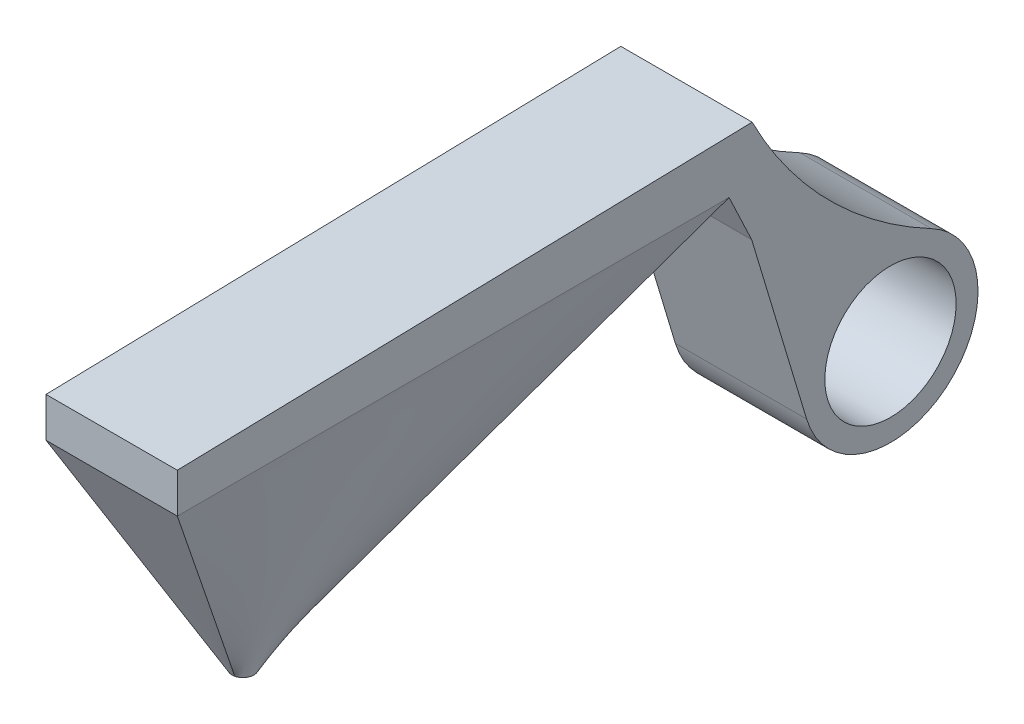
ISO-10303-21;
HEADER;
FILE_DESCRIPTION(('STEP AP214'),'2;1');
FILE_NAME('part.step','',(''),(''),'','','');
FILE_SCHEMA(('AUTOMOTIVE_DESIGN { 1 0 10303 214 1 1 1 1 }'));
ENDSEC;
DATA;
#1=APPLICATION_CONTEXT('core data for automotive mechanical design processes');
#2=APPLICATION_PROTOCOL_DEFINITION('international standard','automotive_design',2000,#1);
#3=PRODUCT_CONTEXT('',#1,'mechanical');
#4=PRODUCT('Part','Part','',(#3));
#5=PRODUCT_RELATED_PRODUCT_CATEGORY('part','',(#4));
#6=PRODUCT_DEFINITION_FORMATION('','',#4);
#7=PRODUCT_DEFINITION_CONTEXT('part definition',#1,'design');
#8=PRODUCT_DEFINITION('design','',#6,#7);
#9=PRODUCT_DEFINITION_SHAPE('','',#8);
#10=(LENGTH_UNIT() NAMED_UNIT(*) SI_UNIT(.MILLI.,.METRE.));
#11=(NAMED_UNIT(*) PLANE_ANGLE_UNIT() SI_UNIT($,.RADIAN.));
#12=(NAMED_UNIT(*) SI_UNIT($,.STERADIAN.) SOLID_ANGLE_UNIT());
#13=UNCERTAINTY_MEASURE_WITH_UNIT(LENGTH_MEASURE(1.E-05),#10,'distance_accuracy_value','');
#14=(GEOMETRIC_REPRESENTATION_CONTEXT(3) GLOBAL_UNCERTAINTY_ASSIGNED_CONTEXT((#13)) GLOBAL_UNIT_ASSIGNED_CONTEXT((#10,
#11,#12)) REPRESENTATION_CONTEXT('',''));
#15=CARTESIAN_POINT('',(0.,0.,0.));
#16=DIRECTION('',(0.,0.,1.));
#17=DIRECTION('',(1.,0.,0.));
#18=AXIS2_PLACEMENT_3D('',#15,#16,#17);
#19=CARTESIAN_POINT('',(3.,-0.907670555941161,0.));
#20=DIRECTION('',(0.,1.,0.));
#21=DIRECTION('',(0.,0.,1.));
#22=AXIS2_PLACEMENT_3D('',#19,#20,#21);
#23=PLANE('',#22);
#24=CARTESIAN_POINT('',(0.,-0.907670555941161,0.));
#25=CARTESIAN_POINT('',(0.,-0.907670555941161,-1.05048056428268));
#26=CARTESIAN_POINT('',(0.,-0.907670555941161,-2.10096112856537));
#27=CARTESIAN_POINT('',(0.,-0.907670555941161,-4.20192225713073));
#28=CARTESIAN_POINT('',(0.,-0.907670555941161,-5.25240282141341));
#29=CARTESIAN_POINT('',(0.,-0.907670555941161,-7.35336394997876));
#30=CARTESIAN_POINT('',(0.,-0.907670555941161,-8.40384451426144));
#31=CARTESIAN_POINT('',(0.,-0.907670555941161,-10.5048056428268));
#32=CARTESIAN_POINT('',(0.,-0.907670555941161,-11.5552862071095));
#33=CARTESIAN_POINT('',(0.,-0.907670555941161,-12.6057667713921));
#34=B_SPLINE_CURVE_WITH_KNOTS('',3,(#24,#25,#26,#27,#28,#29,#30,#31,#32,#33),.UNSPECIFIED.,.F.,
.F.,(4,2,2,2,4),(0.,0.25,0.5,0.75,1.),.UNSPECIFIED.);
#35=CARTESIAN_POINT('',(0.,-0.907670555941161,0.));
#36=VERTEX_POINT('',#35);
#37=CARTESIAN_POINT('',(0.,-0.907670555941161,-12.6057667713921));
#38=VERTEX_POINT('',#37);
#39=EDGE_CURVE('E227',#36,#38,#34,.T.);
#40=ORIENTED_EDGE('',*,*,#39,.F.);
#41=CARTESIAN_POINT('',(3.,-0.907670555941161,0.));
#42=CARTESIAN_POINT('',(2.5,-0.907670555941161,0.));
#43=CARTESIAN_POINT('',(2.,-0.907670555941161,0.));
#44=CARTESIAN_POINT('',(0.999999999999998,-0.907670555941161,0.));
#45=CARTESIAN_POINT('',(0.499999999999999,-0.907670555941161,0.));
#46=CARTESIAN_POINT('',(0.,-0.907670555941161,0.));
#47=B_SPLINE_CURVE_WITH_KNOTS('',3,(#41,#42,#43,#44,#45,#46),.UNSPECIFIED.,.F.,.F.,(4,2,4),(0.,
0.5,1.),.UNSPECIFIED.);
#48=CARTESIAN_POINT('',(3.,-0.907670555941161,0.));
#49=VERTEX_POINT('',#48);
#50=EDGE_CURVE('E12',#49,#36,#47,.T.);
#51=ORIENTED_EDGE('',*,*,#50,.F.);
#52=CARTESIAN_POINT('',(3.,-0.907670555941161,-12.6057667713921));
#53=CARTESIAN_POINT('',(3.,-0.907670555941161,-11.5552862071095));
#54=CARTESIAN_POINT('',(3.,-0.907670555941161,-10.5048056428268));
#55=CARTESIAN_POINT('',(3.,-0.907670555941161,-8.40384451426143));
#56=CARTESIAN_POINT('',(3.,-0.907670555941161,-7.35336394997875));
#57=CARTESIAN_POINT('',(3.,-0.907670555941161,-5.2524028214134));
#58=CARTESIAN_POINT('',(3.,-0.907670555941161,-4.20192225713072));
#59=CARTESIAN_POINT('',(3.,-0.907670555941161,-2.10096112856536));
#60=CARTESIAN_POINT('',(3.,-0.907670555941161,-1.05048056428268));
#61=CARTESIAN_POINT('',(3.,-0.907670555941161,0.));
#62=B_SPLINE_CURVE_WITH_KNOTS('',3,(#52,#53,#54,#55,#56,#57,#58,#59,#60,#61),.UNSPECIFIED.,.F.,
.F.,(4,2,2,2,4),(0.,0.25,0.5,0.75,1.),.UNSPECIFIED.);
#63=CARTESIAN_POINT('',(3.,-0.907670555941161,-12.6057667713921));
#64=VERTEX_POINT('',#63);
#65=EDGE_CURVE('E57',#49,#64,#62,.F.);
#66=ORIENTED_EDGE('',*,*,#65,.T.);
#67=CARTESIAN_POINT('',(0.,-0.907670555941161,-12.6057667713921));
#68=CARTESIAN_POINT('',(0.499999999999999,-0.907670555941161,-12.6057667713921));
#69=CARTESIAN_POINT('',(0.999999999999999,-0.907670555941161,-12.6057667713921));
#70=CARTESIAN_POINT('',(2.,-0.907670555941161,-12.6057667713921));
#71=CARTESIAN_POINT('',(2.5,-0.907670555941161,-12.6057667713921));
#72=CARTESIAN_POINT('',(3.,-0.907670555941161,-12.6057667713921));
#73=B_SPLINE_CURVE_WITH_KNOTS('',3,(#67,#68,#69,#70,#71,#72),.UNSPECIFIED.,.F.,.F.,(4,2,4),(0.,
0.5,1.),.UNSPECIFIED.);
#74=EDGE_CURVE('E169',#64,#38,#73,.F.);
#75=ORIENTED_EDGE('',*,*,#74,.T.);
#76=EDGE_LOOP('',(#40,#51,#66,#75));
#77=FACE_BOUND('',#76,.T.);
#78=ADVANCED_FACE('F47',(#77),#23,.T.);
#79=CARTESIAN_POINT('',(1.5,-6.17796345903512,-3.));
#80=DIRECTION('',(0.,-1.,0.));
#81=DIRECTION('',(0.,0.,-1.));
#82=AXIS2_PLACEMENT_3D('',#79,#80,#81);
#83=PLANE('',#82);
#84=CARTESIAN_POINT('',(1.44211993787603,-6.17796345903512,-3.2432075212828));
#85=CARTESIAN_POINT('',(1.40268667227035,-6.17796345903512,-3.23382294365556));
#86=CARTESIAN_POINT('',(1.35638767309794,-6.17796345903512,-3.21241052529155));
#87=CARTESIAN_POINT('',(1.27856211246946,-6.17796345903512,-3.12925940452774));
#88=CARTESIAN_POINT('',(1.25,-6.17796345903512,-3.06582853498345));
#89=CARTESIAN_POINT('',(1.25,-6.17796345903512,-2.93417146501655));
#90=CARTESIAN_POINT('',(1.27856211246946,-6.17796345903512,-2.87074059547226));
#91=CARTESIAN_POINT('',(1.35638767309794,-6.17796345903512,-2.78758947470846));
#92=CARTESIAN_POINT('',(1.40268667227035,-6.17796345903512,-2.76617705634444));
#93=CARTESIAN_POINT('',(1.44211993787603,-6.17796345903512,-2.7567924787172));
#94=B_SPLINE_CURVE_WITH_KNOTS('',3,(#84,#85,#86,#87,#88,#89,#90,#91,#92,#93),.UNSPECIFIED.,.F.,
.F.,(4,2,2,2,4),(0.,0.25,0.5,0.75,1.),.UNSPECIFIED.);
#95=CARTESIAN_POINT('',(1.44211993787603,-6.17796345903512,-2.7567924787172));
#96=VERTEX_POINT('',#95);
#97=CARTESIAN_POINT('',(1.44211993787603,-6.17796345903512,-3.2432075212828));
#98=VERTEX_POINT('',#97);
#99=EDGE_CURVE('E99',#96,#98,#94,.F.);
#100=ORIENTED_EDGE('',*,*,#99,.T.);
#101=CARTESIAN_POINT('',(1.55788006212397,-6.17796345903512,-3.2432075212828));
#102=CARTESIAN_POINT('',(1.53911090686948,-6.17796345903512,-3.24767432340477));
#103=CARTESIAN_POINT('',(1.51955545343474,-6.17796345903512,-3.24990772446575));
#104=CARTESIAN_POINT('',(1.48044454656526,-6.17796345903512,-3.24990772446575));
#105=CARTESIAN_POINT('',(1.46088909313052,-6.17796345903512,-3.24767432340477));
#106=CARTESIAN_POINT('',(1.44211993787603,-6.17796345903512,-3.2432075212828));
#107=B_SPLINE_CURVE_WITH_KNOTS('',3,(#101,#102,#103,#104,#105,#106),.UNSPECIFIED.,.F.,.F.,(4,2,
4),(0.,0.5,1.),.UNSPECIFIED.);
#108=CARTESIAN_POINT('',(1.55788006212397,-6.17796345903512,-3.2432075212828));
#109=VERTEX_POINT('',#108);
#110=EDGE_CURVE('E111',#98,#109,#107,.F.);
#111=ORIENTED_EDGE('',*,*,#110,.T.);
#112=CARTESIAN_POINT('',(1.55788006212397,-6.17796345903512,-2.7567924787172));
#113=CARTESIAN_POINT('',(1.59731332772965,-6.17796345903512,-2.76617705634444));
#114=CARTESIAN_POINT('',(1.64361232690206,-6.17796345903512,-2.78758947470846));
#115=CARTESIAN_POINT('',(1.72143788753054,-6.17796345903512,-2.87074059547225));
#116=CARTESIAN_POINT('',(1.75,-6.17796345903512,-2.93417146501655));
#117=CARTESIAN_POINT('',(1.75,-6.17796345903512,-3.06582853498345));
#118=CARTESIAN_POINT('',(1.72143788753054,-6.17796345903512,-3.12925940452775));
#119=CARTESIAN_POINT('',(1.64361232690206,-6.17796345903512,-3.21241052529155));
#120=CARTESIAN_POINT('',(1.59731332772965,-6.17796345903512,-3.23382294365556));
#121=CARTESIAN_POINT('',(1.55788006212397,-6.17796345903512,-3.2432075212828));
#122=B_SPLINE_CURVE_WITH_KNOTS('',3,(#112,#113,#114,#115,#116,#117,#118,#119,#120,#121),
.UNSPECIFIED.,.F.,.F.,(4,2,2,2,4),(0.,0.25,0.5,0.75,1.),.UNSPECIFIED.);
#123=CARTESIAN_POINT('',(1.55788006212397,-6.17796345903512,-2.7567924787172));
#124=VERTEX_POINT('',#123);
#125=EDGE_CURVE('E117',#109,#124,#122,.F.);
#126=ORIENTED_EDGE('',*,*,#125,.T.);
#127=CARTESIAN_POINT('',(1.44211993787603,-6.17796345903512,-2.7567924787172));
#128=CARTESIAN_POINT('',(1.46088909313052,-6.17796345903512,-2.75232567659523));
#129=CARTESIAN_POINT('',(1.48044454656526,-6.17796345903512,-2.75009227553425));
#130=CARTESIAN_POINT('',(1.51955545343474,-6.17796345903512,-2.75009227553425));
#131=CARTESIAN_POINT('',(1.53911090686948,-6.17796345903512,-2.75232567659523));
#132=CARTESIAN_POINT('',(1.55788006212397,-6.17796345903512,-2.7567924787172));
#133=B_SPLINE_CURVE_WITH_KNOTS('',3,(#127,#128,#129,#130,#131,#132),.UNSPECIFIED.,.F.,.F.,(4,2,
4),(0.,0.5,1.),.UNSPECIFIED.);
#134=EDGE_CURVE('E94',#124,#96,#133,.F.);
#135=ORIENTED_EDGE('',*,*,#134,.T.);
#136=EDGE_LOOP('',(#100,#111,#126,#135));
#137=FACE_BOUND('',#136,.T.);
#138=ADVANCED_FACE('F115',(#137),#83,.T.);
#139=CARTESIAN_POINT('',(1.44211993787603,-6.17796345903512,-2.7567924787172));
#140=CARTESIAN_POINT('',(0.,-0.907670555941161,0.));
#141=CARTESIAN_POINT('',(1.46088909313052,-6.17796345903512,-2.75232567659523));
#142=CARTESIAN_POINT('',(0.499999999999999,-0.907670555941161,0.));
#143=CARTESIAN_POINT('',(1.48044454656526,-6.17796345903512,-2.75009227553425));
#144=CARTESIAN_POINT('',(0.999999999999998,-0.907670555941161,0.));
#145=CARTESIAN_POINT('',(1.51955545343474,-6.17796345903512,-2.75009227553425));
#146=CARTESIAN_POINT('',(2.,-0.907670555941161,0.));
#147=CARTESIAN_POINT('',(1.53911090686948,-6.17796345903512,-2.75232567659523));
#148=CARTESIAN_POINT('',(2.5,-0.907670555941161,0.));
#149=CARTESIAN_POINT('',(1.55788006212397,-6.17796345903512,-2.7567924787172));
#150=CARTESIAN_POINT('',(3.,-0.907670555941161,0.));
#151=B_SPLINE_SURFACE_WITH_KNOTS('',3,1,((#139,#140),(#141,#142),(#143,#144),(#145,#146),(#147,
#148),(#149,#150)),.UNSPECIFIED.,.F.,.F.,.F.,(4,2,4),(2,2),(0.,0.5,1.),(0.,1.),.UNSPECIFIED.);
#152=CARTESIAN_POINT('',(1.55788006212397,-6.17796345903512,-2.7567924787172));
#153=CARTESIAN_POINT('',(3.,-0.907670555941161,0.));
#154=B_SPLINE_CURVE_WITH_KNOTS('',1,(#152,#153),.UNSPECIFIED.,.F.,.F.,(2,2),(0.,1.),.UNSPECIFIED.);
#155=EDGE_CURVE('E98',#124,#49,#154,.T.);
#156=CARTESIAN_POINT('',(0.,-0.90767055594116,0.));
#157=CARTESIAN_POINT('',(1.44211993787603,-6.17796345903512,-2.75679247871719));
#158=B_SPLINE_CURVE_WITH_KNOTS('',1,(#156,#157),.UNSPECIFIED.,.F.,.F.,(2,2),(0.,1.),.UNSPECIFIED.);
#159=EDGE_CURVE('E64',#36,#96,#158,.T.);
#160=ORIENTED_EDGE('',*,*,#134,.F.);
#161=ORIENTED_EDGE('',*,*,#155,.T.);
#162=ORIENTED_EDGE('',*,*,#50,.T.);
#163=ORIENTED_EDGE('',*,*,#159,.T.);
#164=EDGE_LOOP('',(#160,#161,#162,#163));
#165=FACE_BOUND('',#164,.T.);
#166=ADVANCED_FACE('F91',(#165),#151,.T.);
#167=CARTESIAN_POINT('',(1.55788006212397,-6.17796345903512,-2.7567924787172));
#168=CARTESIAN_POINT('',(3.,-0.907670555941161,0.));
#169=CARTESIAN_POINT('',(1.59731332772965,-6.17796345903512,-2.76617705634444));
#170=CARTESIAN_POINT('',(3.,-0.907670555941161,-1.05048056428268));
#171=CARTESIAN_POINT('',(1.64361232690206,-6.17796345903512,-2.78758947470846));
#172=CARTESIAN_POINT('',(3.,-0.907670555941161,-2.10096112856536));
#173=CARTESIAN_POINT('',(1.72143788753054,-6.17796345903512,-2.87074059547225));
#174=CARTESIAN_POINT('',(3.,-0.907670555941161,-4.20192225713072));
#175=CARTESIAN_POINT('',(1.75,-6.17796345903512,-2.93417146501655));
#176=CARTESIAN_POINT('',(3.,-0.907670555941161,-5.2524028214134));
#177=CARTESIAN_POINT('',(1.75,-6.17796345903512,-3.06582853498345));
#178=CARTESIAN_POINT('',(3.,-0.907670555941161,-7.35336394997875));
#179=CARTESIAN_POINT('',(1.72143788753054,-6.17796345903512,-3.12925940452775));
#180=CARTESIAN_POINT('',(3.,-0.907670555941161,-8.40384451426143));
#181=CARTESIAN_POINT('',(1.64361232690206,-6.17796345903512,-3.21241052529155));
#182=CARTESIAN_POINT('',(3.,-0.907670555941161,-10.5048056428268));
#183=CARTESIAN_POINT('',(1.59731332772965,-6.17796345903512,-3.23382294365556));
#184=CARTESIAN_POINT('',(3.,-0.907670555941161,-11.5552862071095));
#185=CARTESIAN_POINT('',(1.55788006212397,-6.17796345903512,-3.2432075212828));
#186=CARTESIAN_POINT('',(3.,-0.907670555941161,-12.6057667713921));
#187=B_SPLINE_SURFACE_WITH_KNOTS('',3,1,((#167,#168),(#169,#170),(#171,#172),(#173,#174),(#175,
#176),(#177,#178),(#179,#180),(#181,#182),(#183,#184),(#185,#186)),.UNSPECIFIED.,.F.,.F.,.F.,(4,
2,2,2,4),(2,2),(0.,0.25,0.5,0.75,1.),(0.,1.),.UNSPECIFIED.);
#188=CARTESIAN_POINT('',(1.55788006212397,-6.17796345903512,-3.2432075212828));
#189=CARTESIAN_POINT('',(3.,-0.907670555941161,-12.6057667713921));
#190=B_SPLINE_CURVE_WITH_KNOTS('',1,(#188,#189),.UNSPECIFIED.,.F.,.F.,(2,2),(0.,1.),.UNSPECIFIED.);
#191=EDGE_CURVE('E161',#109,#64,#190,.T.);
#192=ORIENTED_EDGE('',*,*,#125,.F.);
#193=ORIENTED_EDGE('',*,*,#191,.T.);
#194=ORIENTED_EDGE('',*,*,#65,.F.);
#195=ORIENTED_EDGE('',*,*,#155,.F.);
#196=EDGE_LOOP('',(#192,#193,#194,#195));
#197=FACE_BOUND('',#196,.T.);
#198=ADVANCED_FACE('F160',(#197),#187,.T.);
#199=CARTESIAN_POINT('',(1.44211993787603,-6.17796345903512,-3.2432075212828));
#200=CARTESIAN_POINT('',(0.,-0.907670555941161,-12.6057667713921));
#201=CARTESIAN_POINT('',(1.40268667227035,-6.17796345903512,-3.23382294365556));
#202=CARTESIAN_POINT('',(0.,-0.907670555941161,-11.5552862071095));
#203=CARTESIAN_POINT('',(1.35638767309794,-6.17796345903512,-3.21241052529155));
#204=CARTESIAN_POINT('',(0.,-0.907670555941161,-10.5048056428268));
#205=CARTESIAN_POINT('',(1.27856211246946,-6.17796345903512,-3.12925940452774));
#206=CARTESIAN_POINT('',(0.,-0.907670555941161,-8.40384451426144));
#207=CARTESIAN_POINT('',(1.25,-6.17796345903512,-3.06582853498345));
#208=CARTESIAN_POINT('',(0.,-0.907670555941161,-7.35336394997876));
#209=CARTESIAN_POINT('',(1.25,-6.17796345903512,-2.93417146501655));
#210=CARTESIAN_POINT('',(0.,-0.907670555941161,-5.25240282141341));
#211=CARTESIAN_POINT('',(1.27856211246946,-6.17796345903512,-2.87074059547226));
#212=CARTESIAN_POINT('',(0.,-0.907670555941161,-4.20192225713073));
#213=CARTESIAN_POINT('',(1.35638767309794,-6.17796345903512,-2.78758947470846));
#214=CARTESIAN_POINT('',(0.,-0.907670555941161,-2.10096112856537));
#215=CARTESIAN_POINT('',(1.40268667227035,-6.17796345903512,-2.76617705634444));
#216=CARTESIAN_POINT('',(0.,-0.907670555941161,-1.05048056428268));
#217=CARTESIAN_POINT('',(1.44211993787603,-6.17796345903512,-2.7567924787172));
#218=CARTESIAN_POINT('',(0.,-0.907670555941161,0.));
#219=B_SPLINE_SURFACE_WITH_KNOTS('',3,1,((#199,#200),(#201,#202),(#203,#204),(#205,#206),(#207,
#208),(#209,#210),(#211,#212),(#213,#214),(#215,#216),(#217,#218)),.UNSPECIFIED.,.F.,.F.,.F.,(4,
2,2,2,4),(2,2),(0.,0.25,0.5,0.75,1.),(0.,1.),.UNSPECIFIED.);
#220=CARTESIAN_POINT('',(1.44211993787603,-6.17796345903512,-3.2432075212828));
#221=CARTESIAN_POINT('',(0.,-0.907670555941161,-12.6057667713921));
#222=B_SPLINE_CURVE_WITH_KNOTS('',1,(#220,#221),.UNSPECIFIED.,.F.,.F.,(2,2),(0.,1.),.UNSPECIFIED.);
#223=EDGE_CURVE('E106',#98,#38,#222,.T.);
#224=ORIENTED_EDGE('',*,*,#99,.F.);
#225=ORIENTED_EDGE('',*,*,#159,.F.);
#226=ORIENTED_EDGE('',*,*,#39,.T.);
#227=ORIENTED_EDGE('',*,*,#223,.F.);
#228=EDGE_LOOP('',(#224,#225,#226,#227));
#229=FACE_BOUND('',#228,.T.);
#230=ADVANCED_FACE('F104',(#229),#219,.T.);
#231=CARTESIAN_POINT('',(1.55788006212397,-6.17796345903512,-3.2432075212828));
#232=CARTESIAN_POINT('',(3.,-0.907670555941161,-12.6057667713921));
#233=CARTESIAN_POINT('',(1.53911090686948,-6.17796345903512,-3.24767432340477));
#234=CARTESIAN_POINT('',(2.5,-0.907670555941161,-12.6057667713921));
#235=CARTESIAN_POINT('',(1.51955545343474,-6.17796345903512,-3.24990772446575));
#236=CARTESIAN_POINT('',(2.,-0.907670555941161,-12.6057667713921));
#237=CARTESIAN_POINT('',(1.48044454656526,-6.17796345903512,-3.24990772446575));
#238=CARTESIAN_POINT('',(0.999999999999999,-0.907670555941161,-12.6057667713921));
#239=CARTESIAN_POINT('',(1.46088909313052,-6.17796345903512,-3.24767432340477));
#240=CARTESIAN_POINT('',(0.499999999999999,-0.907670555941161,-12.6057667713921));
#241=CARTESIAN_POINT('',(1.44211993787603,-6.17796345903512,-3.2432075212828));
#242=CARTESIAN_POINT('',(0.,-0.907670555941161,-12.6057667713921));
#243=B_SPLINE_SURFACE_WITH_KNOTS('',3,1,((#231,#232),(#233,#234),(#235,#236),(#237,#238),(#239,
#240),(#241,#242)),.UNSPECIFIED.,.F.,.F.,.F.,(4,2,4),(2,2),(0.,0.5,1.),(0.,1.),.UNSPECIFIED.);
#244=ORIENTED_EDGE('',*,*,#110,.F.);
#245=ORIENTED_EDGE('',*,*,#223,.T.);
#246=ORIENTED_EDGE('',*,*,#74,.F.);
#247=ORIENTED_EDGE('',*,*,#191,.F.);
#248=EDGE_LOOP('',(#244,#245,#246,#247));
#249=FACE_BOUND('',#248,.T.);
#250=ADVANCED_FACE('F168',(#249),#243,.T.);
#251=CLOSED_SHELL('',(#78,#138,#166,#198,#230,#250));
#252=MANIFOLD_SOLID_BREP('B2',#251);
#253=CARTESIAN_POINT('',(3.,4.71352462951417,-21.7441349750694));
#254=DIRECTION('',(-1.,0.,0.));
#255=DIRECTION('',(0.,0.,1.));
#256=AXIS2_PLACEMENT_3D('',#253,#254,#255);
#257=CYLINDRICAL_SURFACE('',#256,9.66730664719273);
#258=CARTESIAN_POINT('',(0.,4.71352462951417,-21.7441349750694));
#259=DIRECTION('',(1.,0.,0.));
#260=DIRECTION('',(0.,0.,-1.));
#261=AXIS2_PLACEMENT_3D('',#258,#259,#260);
#262=CIRCLE('',#261,9.66730664719273);
#263=CARTESIAN_POINT('',(0.,0.320027847745723,-13.1328630690472));
#264=VERTEX_POINT('',#263);
#265=CARTESIAN_POINT('',(0.,-3.8338654304691,-17.2276162965565));
#266=VERTEX_POINT('',#265);
#267=EDGE_CURVE('E520',#264,#266,#262,.T.);
#268=ORIENTED_EDGE('',*,*,#267,.F.);
#269=DIRECTION('',(-1.,0.,0.));
#270=VECTOR('',#269,1.);
#271=CARTESIAN_POINT('',(3.,0.320027847745723,-13.1328630690472));
#272=LINE('',#271,#270);
#273=CARTESIAN_POINT('',(3.,0.320027847745723,-13.1328630690472));
#274=VERTEX_POINT('',#273);
#275=EDGE_CURVE('E45',#274,#264,#272,.T.);
#276=ORIENTED_EDGE('',*,*,#275,.F.);
#277=CARTESIAN_POINT('',(3.,4.71352462951417,-21.7441349750694));
#278=DIRECTION('',(1.,0.,0.));
#279=DIRECTION('',(0.,0.,-1.));
#280=AXIS2_PLACEMENT_3D('',#277,#278,#279);
#281=CIRCLE('',#280,9.66730664719273);
#282=CARTESIAN_POINT('',(3.,-3.8338654304691,-17.2276162965565));
#283=VERTEX_POINT('',#282);
#284=EDGE_CURVE('E537',#274,#283,#281,.T.);
#285=ORIENTED_EDGE('',*,*,#284,.T.);
#286=DIRECTION('',(-1.,0.,0.));
#287=VECTOR('',#286,1.);
#288=CARTESIAN_POINT('',(3.,-3.8338654304691,-17.2276162965565));
#289=LINE('',#288,#287);
#290=EDGE_CURVE('E478',#283,#266,#289,.T.);
#291=ORIENTED_EDGE('',*,*,#290,.T.);
#292=EDGE_LOOP('',(#268,#276,#285,#291));
#293=FACE_BOUND('',#292,.T.);
#294=ADVANCED_FACE('F430',(#293),#257,.F.);
#295=CARTESIAN_POINT('',(3.,0.,0.));
#296=DIRECTION('',(0.,0.999703220877761,0.0243612431257298));
#297=DIRECTION('',(0.,-0.0243612431257298,0.999703220877761));
#298=AXIS2_PLACEMENT_3D('',#295,#296,#297);
#299=PLANE('',#298);
#300=DIRECTION('',(0.,0.0243612431257298,-0.999703220877761));
#301=VECTOR('',#300,1.);
#302=CARTESIAN_POINT('',(0.,0.,0.));
#303=LINE('',#302,#301);
#304=CARTESIAN_POINT('',(0.,0.,0.));
#305=VERTEX_POINT('',#304);
#306=EDGE_CURVE('E523',#305,#264,#303,.T.);
#307=ORIENTED_EDGE('',*,*,#306,.F.);
#308=DIRECTION('',(-1.,0.,0.));
#309=VECTOR('',#308,1.);
#310=CARTESIAN_POINT('',(3.,0.,0.));
#311=LINE('',#310,#309);
#312=CARTESIAN_POINT('',(3.,0.,0.));
#313=VERTEX_POINT('',#312);
#314=EDGE_CURVE('E438',#313,#305,#311,.T.);
#315=ORIENTED_EDGE('',*,*,#314,.F.);
#316=DIRECTION('',(0.,0.0243612431257298,-0.999703220877761));
#317=VECTOR('',#316,1.);
#318=CARTESIAN_POINT('',(3.,0.,0.));
#319=LINE('',#318,#317);
#320=EDGE_CURVE('E558',#313,#274,#319,.T.);
#321=ORIENTED_EDGE('',*,*,#320,.T.);
#322=ORIENTED_EDGE('',*,*,#275,.T.);
#323=EDGE_LOOP('',(#307,#315,#321,#322));
#324=FACE_BOUND('',#323,.T.);
#325=ADVANCED_FACE('F557',(#324),#299,.T.);
#326=CARTESIAN_POINT('',(3.,0.,0.));
#327=DIRECTION('',(0.,0.,-1.));
#328=DIRECTION('',(0.,1.,0.));
#329=AXIS2_PLACEMENT_3D('',#326,#327,#328);
#330=PLANE('',#329);
#331=DIRECTION('',(0.,-1.,0.));
#332=VECTOR('',#331,1.);
#333=CARTESIAN_POINT('',(0.,0.,0.));
#334=LINE('',#333,#332);
#335=CARTESIAN_POINT('',(0.,-0.907670555941161,0.));
#336=VERTEX_POINT('',#335);
#337=EDGE_CURVE('E526',#305,#336,#334,.T.);
#338=ORIENTED_EDGE('',*,*,#337,.T.);
#339=DIRECTION('',(-1.,0.,0.));
#340=VECTOR('',#339,1.);
#341=CARTESIAN_POINT('',(3.,-0.907670555941161,0.));
#342=LINE('',#341,#340);
#343=CARTESIAN_POINT('',(3.,-0.907670555941161,0.));
#344=VERTEX_POINT('',#343);
#345=EDGE_CURVE('E541',#344,#336,#342,.T.);
#346=ORIENTED_EDGE('',*,*,#345,.F.);
#347=DIRECTION('',(0.,-1.,0.));
#348=VECTOR('',#347,1.);
#349=CARTESIAN_POINT('',(3.,0.,0.));
#350=LINE('',#349,#348);
#351=EDGE_CURVE('E548',#313,#344,#350,.T.);
#352=ORIENTED_EDGE('',*,*,#351,.F.);
#353=ORIENTED_EDGE('',*,*,#314,.T.);
#354=EDGE_LOOP('',(#338,#346,#352,#353));
#355=FACE_BOUND('',#354,.T.);
#356=ADVANCED_FACE('F546',(#355),#330,.F.);
#357=CARTESIAN_POINT('',(3.,-0.907670555941161,0.));
#358=DIRECTION('',(0.,1.,0.));
#359=DIRECTION('',(0.,0.,1.));
#360=AXIS2_PLACEMENT_3D('',#357,#358,#359);
#361=PLANE('',#360);
#362=DIRECTION('',(0.,0.,-1.));
#363=VECTOR('',#362,1.);
#364=CARTESIAN_POINT('',(0.,-0.907670555941161,0.));
#365=LINE('',#364,#363);
#366=CARTESIAN_POINT('',(0.,-0.907670555941161,-12.6057667713921));
#367=VERTEX_POINT('',#366);
#368=EDGE_CURVE('E528',#336,#367,#365,.T.);
#369=ORIENTED_EDGE('',*,*,#368,.T.);
#370=DIRECTION('',(-1.,0.,0.));
#371=VECTOR('',#370,1.);
#372=CARTESIAN_POINT('',(3.,-0.907670555941161,-12.6057667713921));
#373=LINE('',#372,#371);
#374=CARTESIAN_POINT('',(3.,-0.907670555941161,-12.6057667713921));
#375=VERTEX_POINT('',#374);
#376=EDGE_CURVE('E509',#375,#367,#373,.T.);
#377=ORIENTED_EDGE('',*,*,#376,.F.);
#378=DIRECTION('',(0.,0.,-1.));
#379=VECTOR('',#378,1.);
#380=CARTESIAN_POINT('',(3.,-0.907670555941161,0.));
#381=LINE('',#380,#379);
#382=EDGE_CURVE('E500',#344,#375,#381,.T.);
#383=ORIENTED_EDGE('',*,*,#382,.F.);
#384=ORIENTED_EDGE('',*,*,#345,.T.);
#385=EDGE_LOOP('',(#369,#377,#383,#384));
#386=FACE_BOUND('',#385,.T.);
#387=ADVANCED_FACE('F566',(#386),#361,.F.);
#388=CARTESIAN_POINT('',(3.,4.70381029762597,-9.95404724804783));
#389=DIRECTION('',(0.,0.427250485793273,-0.904133299015921));
#390=DIRECTION('',(0.,0.904133299015921,0.427250485793273));
#391=AXIS2_PLACEMENT_3D('',#388,#389,#390);
#392=PLANE('',#391);
#393=DIRECTION('',(0.,-0.904133299015921,-0.427250485793273));
#394=VECTOR('',#393,1.);
#395=CARTESIAN_POINT('',(0.,4.70381029762597,-9.95404724804783));
#396=LINE('',#395,#394);
#397=CARTESIAN_POINT('',(0.,-1.9997799548143,-13.121845840392));
#398=VERTEX_POINT('',#397);
#399=EDGE_CURVE('E508',#367,#398,#396,.T.);
#400=ORIENTED_EDGE('',*,*,#399,.T.);
#401=DIRECTION('',(-1.,0.,0.));
#402=VECTOR('',#401,1.);
#403=CARTESIAN_POINT('',(3.,-1.9997799548143,-13.121845840392));
#404=LINE('',#403,#402);
#405=CARTESIAN_POINT('',(3.,-1.9997799548143,-13.121845840392));
#406=VERTEX_POINT('',#405);
#407=EDGE_CURVE('E505',#406,#398,#404,.T.);
#408=ORIENTED_EDGE('',*,*,#407,.F.);
#409=DIRECTION('',(0.,-0.904133299015921,-0.427250485793273));
#410=VECTOR('',#409,1.);
#411=CARTESIAN_POINT('',(3.,4.70381029762597,-9.95404724804783));
#412=LINE('',#411,#410);
#413=EDGE_CURVE('E493',#375,#406,#412,.T.);
#414=ORIENTED_EDGE('',*,*,#413,.F.);
#415=ORIENTED_EDGE('',*,*,#376,.T.);
#416=EDGE_LOOP('',(#400,#408,#414,#415));
#417=FACE_BOUND('',#416,.T.);
#418=ADVANCED_FACE('F506',(#417),#392,.F.);
#419=CARTESIAN_POINT('',(3.,3.45202185132422,-11.4829114005639));
#420=DIRECTION('',(0.,0.287894784783591,-0.9576620452406));
#421=DIRECTION('',(0.,0.957662045240601,0.287894784783591));
#422=AXIS2_PLACEMENT_3D('',#419,#420,#421);
#423=PLANE('',#422);
#424=DIRECTION('',(0.,-0.957662045240601,-0.287894784783591));
#425=VECTOR('',#424,1.);
#426=CARTESIAN_POINT('',(0.,3.45202185132422,-11.4829114005639));
#427=LINE('',#426,#425);
#428=CARTESIAN_POINT('',(0.,-6.17796345903512,-14.3779019268915));
#429=VERTEX_POINT('',#428);
#430=EDGE_CURVE('E471',#398,#429,#427,.T.);
#431=ORIENTED_EDGE('',*,*,#430,.T.);
#432=DIRECTION('',(-1.,0.,0.));
#433=VECTOR('',#432,1.);
#434=CARTESIAN_POINT('',(3.,-6.17796345903512,-14.3779019268915));
#435=LINE('',#434,#433);
#436=CARTESIAN_POINT('',(3.,-6.17796345903512,-14.3779019268915));
#437=VERTEX_POINT('',#436);
#438=EDGE_CURVE('E510',#437,#429,#435,.T.);
#439=ORIENTED_EDGE('',*,*,#438,.F.);
#440=DIRECTION('',(0.,-0.957662045240601,-0.287894784783591));
#441=VECTOR('',#440,1.);
#442=CARTESIAN_POINT('',(3.,3.45202185132422,-11.4829114005639));
#443=LINE('',#442,#441);
#444=EDGE_CURVE('E498',#406,#437,#443,.T.);
#445=ORIENTED_EDGE('',*,*,#444,.F.);
#446=ORIENTED_EDGE('',*,*,#407,.T.);
#447=EDGE_LOOP('',(#431,#439,#445,#446));
#448=FACE_BOUND('',#447,.T.);
#449=ADVANCED_FACE('F512',(#448),#423,.F.);
#450=CARTESIAN_POINT('',(3.,-5.60217388946794,-16.2932260173727));
#451=DIRECTION('',(-1.,0.,0.));
#452=DIRECTION('',(0.,0.,1.));
#453=AXIS2_PLACEMENT_3D('',#450,#451,#452);
#454=CYLINDRICAL_SURFACE('',#453,2.);
#455=CARTESIAN_POINT('',(0.,-5.60217388946794,-16.2932260173727));
#456=DIRECTION('',(1.,0.,0.));
#457=DIRECTION('',(0.,0.,-1.));
#458=AXIS2_PLACEMENT_3D('',#455,#456,#457);
#459=CIRCLE('',#458,2.);
#460=EDGE_CURVE('E532',#429,#266,#459,.T.);
#461=ORIENTED_EDGE('',*,*,#460,.T.);
#462=ORIENTED_EDGE('',*,*,#290,.F.);
#463=CARTESIAN_POINT('',(3.,-5.60217388946794,-16.2932260173727));
#464=DIRECTION('',(1.,0.,0.));
#465=DIRECTION('',(0.,0.,-1.));
#466=AXIS2_PLACEMENT_3D('',#463,#464,#465);
#467=CIRCLE('',#466,2.);
#468=EDGE_CURVE('E446',#437,#283,#467,.T.);
#469=ORIENTED_EDGE('',*,*,#468,.F.);
#470=ORIENTED_EDGE('',*,*,#438,.T.);
#471=EDGE_LOOP('',(#461,#462,#469,#470));
#472=FACE_BOUND('',#471,.T.);
#473=ADVANCED_FACE('F561',(#472),#454,.T.);
#474=CARTESIAN_POINT('',(3.,-5.60217388946794,-16.2932260173727));
#475=DIRECTION('',(-1.,0.,0.));
#476=DIRECTION('',(0.,0.,1.));
#477=AXIS2_PLACEMENT_3D('',#474,#475,#476);
#478=CYLINDRICAL_SURFACE('',#477,1.5);
#479=CARTESIAN_POINT('',(3.,-5.60217388946794,-16.2932260173727));
#480=DIRECTION('',(1.,0.,0.));
#481=DIRECTION('',(0.,0.,-1.));
#482=AXIS2_PLACEMENT_3D('',#479,#480,#481);
#483=CIRCLE('',#482,1.5);
#484=CARTESIAN_POINT('',(3.,-5.60217388946794,-17.7932260173727));
#485=VERTEX_POINT('',#484);
#486=EDGE_CURVE('E514',#485,#485,#483,.T.);
#487=ORIENTED_EDGE('',*,*,#486,.T.);
#488=EDGE_LOOP('',(#487));
#489=FACE_BOUND('',#488,.T.);
#490=CARTESIAN_POINT('',(0.,-5.60217388946794,-16.2932260173727));
#491=DIRECTION('',(1.,0.,0.));
#492=DIRECTION('',(0.,0.,-1.));
#493=AXIS2_PLACEMENT_3D('',#490,#491,#492);
#494=CIRCLE('',#493,1.5);
#495=CARTESIAN_POINT('',(0.,-5.60217388946794,-17.7932260173727));
#496=VERTEX_POINT('',#495);
#497=EDGE_CURVE('E534',#496,#496,#494,.T.);
#498=ORIENTED_EDGE('',*,*,#497,.F.);
#499=EDGE_LOOP('',(#498));
#500=FACE_BOUND('',#499,.T.);
#501=ADVANCED_FACE('F613',(#489,#500),#478,.F.);
#502=CARTESIAN_POINT('',(3.,0.,0.));
#503=DIRECTION('',(1.,0.,0.));
#504=DIRECTION('',(0.,0.,-1.));
#505=AXIS2_PLACEMENT_3D('',#502,#503,#504);
#506=PLANE('',#505);
#507=ORIENTED_EDGE('',*,*,#284,.F.);
#508=ORIENTED_EDGE('',*,*,#320,.F.);
#509=ORIENTED_EDGE('',*,*,#351,.T.);
#510=ORIENTED_EDGE('',*,*,#382,.T.);
#511=ORIENTED_EDGE('',*,*,#413,.T.);
#512=ORIENTED_EDGE('',*,*,#444,.T.);
#513=ORIENTED_EDGE('',*,*,#468,.T.);
#514=EDGE_LOOP('',(#507,#508,#509,#510,#511,#512,#513));
#515=FACE_BOUND('',#514,.T.);
#516=ORIENTED_EDGE('',*,*,#486,.F.);
#517=EDGE_LOOP('',(#516));
#518=FACE_BOUND('',#517,.T.);
#519=ADVANCED_FACE('F495',(#515,#518),#506,.T.);
#520=CARTESIAN_POINT('',(0.,0.,0.));
#521=DIRECTION('',(1.,0.,0.));
#522=DIRECTION('',(0.,0.,-1.));
#523=AXIS2_PLACEMENT_3D('',#520,#521,#522);
#524=PLANE('',#523);
#525=ORIENTED_EDGE('',*,*,#267,.T.);
#526=ORIENTED_EDGE('',*,*,#460,.F.);
#527=ORIENTED_EDGE('',*,*,#430,.F.);
#528=ORIENTED_EDGE('',*,*,#399,.F.);
#529=ORIENTED_EDGE('',*,*,#368,.F.);
#530=ORIENTED_EDGE('',*,*,#337,.F.);
#531=ORIENTED_EDGE('',*,*,#306,.T.);
#532=EDGE_LOOP('',(#525,#526,#527,#528,#529,#530,#531));
#533=FACE_BOUND('',#532,.T.);
#534=ORIENTED_EDGE('',*,*,#497,.T.);
#535=EDGE_LOOP('',(#534));
#536=FACE_BOUND('',#535,.T.);
#537=ADVANCED_FACE('F555',(#533,#536),#524,.F.);
#538=CLOSED_SHELL('',(#294,#325,#356,#387,#418,#449,#473,#501,#519,#537));
#539=MANIFOLD_SOLID_BREP('B6',#538);
#540=ADVANCED_BREP_SHAPE_REPRESENTATION('',(#18,#252,#539),#14);
#541=SHAPE_DEFINITION_REPRESENTATION(#9,#540);
ENDSEC;
END-ISO-10303-21;
